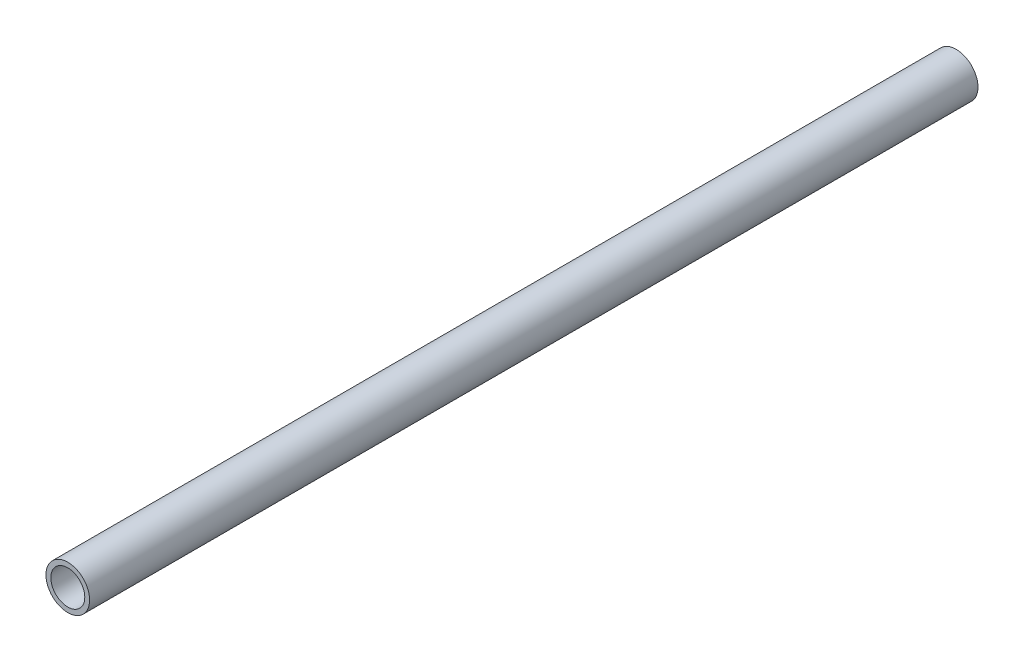
ISO-10303-21;
HEADER;
FILE_DESCRIPTION(('STEP AP214'),'2;1');
FILE_NAME('part.step','',(''),(''),'','','');
FILE_SCHEMA(('AUTOMOTIVE_DESIGN { 1 0 10303 214 1 1 1 1 }'));
ENDSEC;
DATA;
#1=APPLICATION_CONTEXT('core data for automotive mechanical design processes');
#2=APPLICATION_PROTOCOL_DEFINITION('international standard','automotive_design',2000,#1);
#3=PRODUCT_CONTEXT('',#1,'mechanical');
#4=PRODUCT('Part','Part','',(#3));
#5=PRODUCT_RELATED_PRODUCT_CATEGORY('part','',(#4));
#6=PRODUCT_DEFINITION_FORMATION('','',#4);
#7=PRODUCT_DEFINITION_CONTEXT('part definition',#1,'design');
#8=PRODUCT_DEFINITION('design','',#6,#7);
#9=PRODUCT_DEFINITION_SHAPE('','',#8);
#10=(LENGTH_UNIT() NAMED_UNIT(*) SI_UNIT(.MILLI.,.METRE.));
#11=(NAMED_UNIT(*) PLANE_ANGLE_UNIT() SI_UNIT($,.RADIAN.));
#12=(NAMED_UNIT(*) SI_UNIT($,.STERADIAN.) SOLID_ANGLE_UNIT());
#13=UNCERTAINTY_MEASURE_WITH_UNIT(LENGTH_MEASURE(1.E-05),#10,'distance_accuracy_value','');
#14=(GEOMETRIC_REPRESENTATION_CONTEXT(3) GLOBAL_UNCERTAINTY_ASSIGNED_CONTEXT((#13)) GLOBAL_UNIT_ASSIGNED_CONTEXT((#10,
#11,#12)) REPRESENTATION_CONTEXT('',''));
#15=CARTESIAN_POINT('',(0.,0.,0.));
#16=DIRECTION('',(0.,0.,1.));
#17=DIRECTION('',(1.,0.,0.));
#18=AXIS2_PLACEMENT_3D('',#15,#16,#17);
#19=CARTESIAN_POINT('',(0.,0.,366.18));
#20=DIRECTION('',(0.,0.,1.));
#21=DIRECTION('',(1.,0.,0.));
#22=AXIS2_PLACEMENT_3D('',#19,#20,#21);
#23=PLANE('',#22);
#24=CARTESIAN_POINT('',(0.,0.,366.18));
#25=DIRECTION('',(0.,0.,1.));
#26=DIRECTION('',(1.,0.,0.));
#27=AXIS2_PLACEMENT_3D('',#24,#25,#26);
#28=CIRCLE('',#27,9.);
#29=CARTESIAN_POINT('',(9.,0.,366.18));
#30=VERTEX_POINT('',#29);
#31=EDGE_CURVE('E10',#30,#30,#28,.T.);
#32=ORIENTED_EDGE('',*,*,#31,.T.);
#33=EDGE_LOOP('',(#32));
#34=FACE_BOUND('',#33,.T.);
#35=CARTESIAN_POINT('',(0.,0.,366.18));
#36=DIRECTION('',(0.,0.,1.));
#37=DIRECTION('',(1.,0.,0.));
#38=AXIS2_PLACEMENT_3D('',#35,#36,#37);
#39=CIRCLE('',#38,7.);
#40=CARTESIAN_POINT('',(7.,0.,366.18));
#41=VERTEX_POINT('',#40);
#42=EDGE_CURVE('E50',#41,#41,#39,.T.);
#43=ORIENTED_EDGE('',*,*,#42,.F.);
#44=EDGE_LOOP('',(#43));
#45=FACE_BOUND('',#44,.T.);
#46=ADVANCED_FACE('F36',(#34,#45),#23,.T.);
#47=CARTESIAN_POINT('',(0.,0.,0.));
#48=DIRECTION('',(0.,0.,1.));
#49=DIRECTION('',(1.,0.,0.));
#50=AXIS2_PLACEMENT_3D('',#47,#48,#49);
#51=PLANE('',#50);
#52=CARTESIAN_POINT('',(0.,0.,0.));
#53=DIRECTION('',(0.,0.,1.));
#54=DIRECTION('',(1.,0.,0.));
#55=AXIS2_PLACEMENT_3D('',#52,#53,#54);
#56=CIRCLE('',#55,9.);
#57=CARTESIAN_POINT('',(9.,0.,0.));
#58=VERTEX_POINT('',#57);
#59=EDGE_CURVE('E40',#58,#58,#56,.T.);
#60=ORIENTED_EDGE('',*,*,#59,.F.);
#61=EDGE_LOOP('',(#60));
#62=FACE_BOUND('',#61,.T.);
#63=CARTESIAN_POINT('',(0.,0.,0.));
#64=DIRECTION('',(0.,0.,1.));
#65=DIRECTION('',(1.,0.,0.));
#66=AXIS2_PLACEMENT_3D('',#63,#64,#65);
#67=CIRCLE('',#66,7.);
#68=CARTESIAN_POINT('',(7.,0.,0.));
#69=VERTEX_POINT('',#68);
#70=EDGE_CURVE('E52',#69,#69,#67,.T.);
#71=ORIENTED_EDGE('',*,*,#70,.T.);
#72=EDGE_LOOP('',(#71));
#73=FACE_BOUND('',#72,.T.);
#74=ADVANCED_FACE('F63',(#62,#73),#51,.F.);
#75=CARTESIAN_POINT('',(0.,0.,366.18));
#76=DIRECTION('',(0.,0.,-1.));
#77=DIRECTION('',(-1.,0.,0.));
#78=AXIS2_PLACEMENT_3D('',#75,#76,#77);
#79=CYLINDRICAL_SURFACE('',#78,9.);
#80=ORIENTED_EDGE('',*,*,#31,.F.);
#81=EDGE_LOOP('',(#80));
#82=FACE_BOUND('',#81,.T.);
#83=ORIENTED_EDGE('',*,*,#59,.T.);
#84=EDGE_LOOP('',(#83));
#85=FACE_BOUND('',#84,.T.);
#86=ADVANCED_FACE('F38',(#82,#85),#79,.T.);
#87=CARTESIAN_POINT('',(0.,0.,366.18));
#88=DIRECTION('',(0.,0.,-1.));
#89=DIRECTION('',(-1.,0.,0.));
#90=AXIS2_PLACEMENT_3D('',#87,#88,#89);
#91=CYLINDRICAL_SURFACE('',#90,7.);
#92=ORIENTED_EDGE('',*,*,#42,.T.);
#93=EDGE_LOOP('',(#92));
#94=FACE_BOUND('',#93,.T.);
#95=ORIENTED_EDGE('',*,*,#70,.F.);
#96=EDGE_LOOP('',(#95));
#97=FACE_BOUND('',#96,.T.);
#98=ADVANCED_FACE('F59',(#94,#97),#91,.F.);
#99=CLOSED_SHELL('',(#46,#74,#86,#98));
#100=MANIFOLD_SOLID_BREP('B2',#99);
#101=ADVANCED_BREP_SHAPE_REPRESENTATION('',(#18,#100),#14);
#102=SHAPE_DEFINITION_REPRESENTATION(#9,#101);
ENDSEC;
END-ISO-10303-21;
